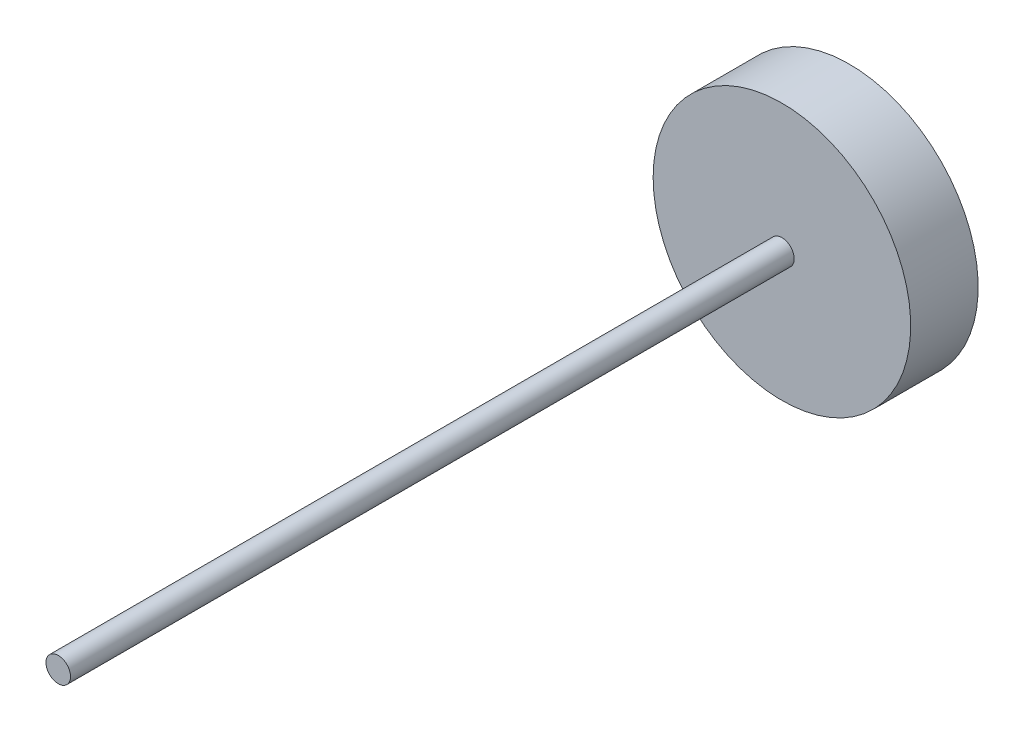
ISO-10303-21;
HEADER;
FILE_DESCRIPTION(('STEP AP214'),'2;1');
FILE_NAME('part.step','',(''),(''),'','','');
FILE_SCHEMA(('AUTOMOTIVE_DESIGN { 1 0 10303 214 1 1 1 1 }'));
ENDSEC;
DATA;
#1=APPLICATION_CONTEXT('core data for automotive mechanical design processes');
#2=APPLICATION_PROTOCOL_DEFINITION('international standard','automotive_design',2000,#1);
#3=PRODUCT_CONTEXT('',#1,'mechanical');
#4=PRODUCT('Part','Part','',(#3));
#5=PRODUCT_RELATED_PRODUCT_CATEGORY('part','',(#4));
#6=PRODUCT_DEFINITION_FORMATION('','',#4);
#7=PRODUCT_DEFINITION_CONTEXT('part definition',#1,'design');
#8=PRODUCT_DEFINITION('design','',#6,#7);
#9=PRODUCT_DEFINITION_SHAPE('','',#8);
#10=(LENGTH_UNIT() NAMED_UNIT(*) SI_UNIT(.MILLI.,.METRE.));
#11=(NAMED_UNIT(*) PLANE_ANGLE_UNIT() SI_UNIT($,.RADIAN.));
#12=(NAMED_UNIT(*) SI_UNIT($,.STERADIAN.) SOLID_ANGLE_UNIT());
#13=UNCERTAINTY_MEASURE_WITH_UNIT(LENGTH_MEASURE(1.E-05),#10,'distance_accuracy_value','');
#14=(GEOMETRIC_REPRESENTATION_CONTEXT(3) GLOBAL_UNCERTAINTY_ASSIGNED_CONTEXT((#13)) GLOBAL_UNIT_ASSIGNED_CONTEXT((#10,
#11,#12)) REPRESENTATION_CONTEXT('',''));
#15=CARTESIAN_POINT('',(0.,0.,0.));
#16=DIRECTION('',(0.,0.,1.));
#17=DIRECTION('',(1.,0.,0.));
#18=AXIS2_PLACEMENT_3D('',#15,#16,#17);
#19=CARTESIAN_POINT('',(0.,0.,25.));
#20=DIRECTION('',(0.,0.,-1.));
#21=DIRECTION('',(-1.,0.,0.));
#22=AXIS2_PLACEMENT_3D('',#19,#20,#21);
#23=CYLINDRICAL_SURFACE('',#22,105.);
#24=CARTESIAN_POINT('',(0.,0.,25.));
#25=DIRECTION('',(0.,0.,-1.));
#26=DIRECTION('',(-1.,0.,0.));
#27=AXIS2_PLACEMENT_3D('',#24,#25,#26);
#28=CIRCLE('',#27,105.);
#29=CARTESIAN_POINT('',(-105.,0.,25.));
#30=VERTEX_POINT('',#29);
#31=EDGE_CURVE('E45',#30,#30,#28,.T.);
#32=ORIENTED_EDGE('',*,*,#31,.T.);
#33=EDGE_LOOP('',(#32));
#34=FACE_BOUND('',#33,.T.);
#35=CARTESIAN_POINT('',(0.,0.,-30.));
#36=DIRECTION('',(0.,0.,-1.));
#37=DIRECTION('',(-1.,0.,0.));
#38=AXIS2_PLACEMENT_3D('',#35,#36,#37);
#39=CIRCLE('',#38,105.);
#40=CARTESIAN_POINT('',(-105.,0.,-30.));
#41=VERTEX_POINT('',#40);
#42=EDGE_CURVE('E50',#41,#41,#39,.T.);
#43=ORIENTED_EDGE('',*,*,#42,.F.);
#44=EDGE_LOOP('',(#43));
#45=FACE_BOUND('',#44,.T.);
#46=ADVANCED_FACE('F37',(#34,#45),#23,.T.);
#47=CARTESIAN_POINT('',(0.,0.,85.));
#48=DIRECTION('',(0.,0.,-1.));
#49=DIRECTION('',(-1.,0.,0.));
#50=AXIS2_PLACEMENT_3D('',#47,#48,#49);
#51=CYLINDRICAL_SURFACE('',#50,10.);
#52=CARTESIAN_POINT('',(0.,0.,25.));
#53=DIRECTION('',(0.,0.,1.));
#54=DIRECTION('',(1.,0.,0.));
#55=AXIS2_PLACEMENT_3D('',#52,#53,#54);
#56=CIRCLE('',#55,10.);
#57=CARTESIAN_POINT('',(10.,0.,25.));
#58=VERTEX_POINT('',#57);
#59=EDGE_CURVE('E10',#58,#58,#56,.T.);
#60=ORIENTED_EDGE('',*,*,#59,.T.);
#61=EDGE_LOOP('',(#60));
#62=FACE_BOUND('',#61,.T.);
#63=CARTESIAN_POINT('',(0.,0.,615.));
#64=DIRECTION('',(0.,0.,1.));
#65=DIRECTION('',(1.,0.,0.));
#66=AXIS2_PLACEMENT_3D('',#63,#64,#65);
#67=CIRCLE('',#66,10.);
#68=CARTESIAN_POINT('',(10.,0.,615.));
#69=VERTEX_POINT('',#68);
#70=EDGE_CURVE('E55',#69,#69,#67,.T.);
#71=ORIENTED_EDGE('',*,*,#70,.F.);
#72=EDGE_LOOP('',(#71));
#73=FACE_BOUND('',#72,.T.);
#74=ADVANCED_FACE('F64',(#62,#73),#51,.T.);
#75=CARTESIAN_POINT('',(0.,0.,25.));
#76=DIRECTION('',(0.,0.,1.));
#77=DIRECTION('',(1.,0.,0.));
#78=AXIS2_PLACEMENT_3D('',#75,#76,#77);
#79=PLANE('',#78);
#80=ORIENTED_EDGE('',*,*,#59,.F.);
#81=EDGE_LOOP('',(#80));
#82=FACE_BOUND('',#81,.T.);
#83=ORIENTED_EDGE('',*,*,#31,.F.);
#84=EDGE_LOOP('',(#83));
#85=FACE_BOUND('',#84,.T.);
#86=ADVANCED_FACE('F39',(#82,#85),#79,.T.);
#87=CARTESIAN_POINT('',(0.,0.,-30.));
#88=DIRECTION('',(0.,0.,-1.));
#89=DIRECTION('',(-1.,0.,0.));
#90=AXIS2_PLACEMENT_3D('',#87,#88,#89);
#91=PLANE('',#90);
#92=ORIENTED_EDGE('',*,*,#42,.T.);
#93=EDGE_LOOP('',(#92));
#94=FACE_BOUND('',#93,.T.);
#95=ADVANCED_FACE('F71',(#94),#91,.T.);
#96=CARTESIAN_POINT('',(0.,0.,615.));
#97=DIRECTION('',(0.,0.,1.));
#98=DIRECTION('',(1.,0.,0.));
#99=AXIS2_PLACEMENT_3D('',#96,#97,#98);
#100=PLANE('',#99);
#101=ORIENTED_EDGE('',*,*,#70,.T.);
#102=EDGE_LOOP('',(#101));
#103=FACE_BOUND('',#102,.T.);
#104=ADVANCED_FACE('F62',(#103),#100,.T.);
#105=CLOSED_SHELL('',(#46,#74,#86,#95,#104));
#106=MANIFOLD_SOLID_BREP('B2',#105);
#107=ADVANCED_BREP_SHAPE_REPRESENTATION('',(#18,#106),#14);
#108=SHAPE_DEFINITION_REPRESENTATION(#9,#107);
ENDSEC;
END-ISO-10303-21;
